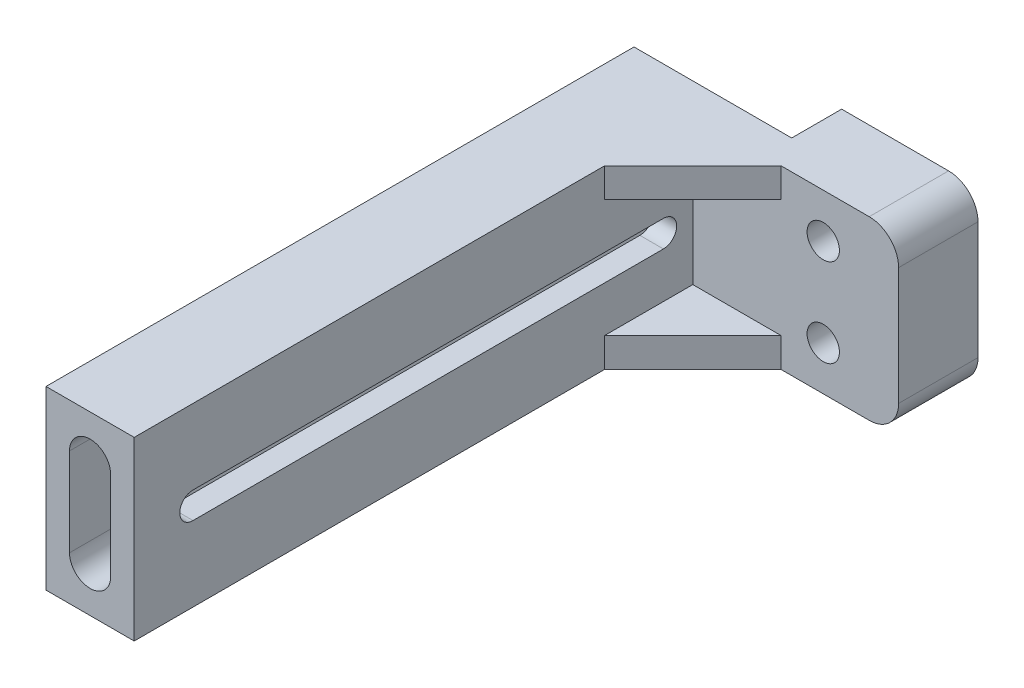
ISO-10303-21;
HEADER;
FILE_DESCRIPTION(('STEP AP214'),'2;1');
FILE_NAME('part.step','',(''),(''),'','','');
FILE_SCHEMA(('AUTOMOTIVE_DESIGN { 1 0 10303 214 1 1 1 1 }'));
ENDSEC;
DATA;
#1=APPLICATION_CONTEXT('core data for automotive mechanical design processes');
#2=APPLICATION_PROTOCOL_DEFINITION('international standard','automotive_design',2000,#1);
#3=PRODUCT_CONTEXT('',#1,'mechanical');
#4=PRODUCT('Part','Part','',(#3));
#5=PRODUCT_RELATED_PRODUCT_CATEGORY('part','',(#4));
#6=PRODUCT_DEFINITION_FORMATION('','',#4);
#7=PRODUCT_DEFINITION_CONTEXT('part definition',#1,'design');
#8=PRODUCT_DEFINITION('design','',#6,#7);
#9=PRODUCT_DEFINITION_SHAPE('','',#8);
#10=(LENGTH_UNIT() NAMED_UNIT(*) SI_UNIT(.MILLI.,.METRE.));
#11=(NAMED_UNIT(*) PLANE_ANGLE_UNIT() SI_UNIT($,.RADIAN.));
#12=(NAMED_UNIT(*) SI_UNIT($,.STERADIAN.) SOLID_ANGLE_UNIT());
#13=UNCERTAINTY_MEASURE_WITH_UNIT(LENGTH_MEASURE(1.E-05),#10,'distance_accuracy_value','');
#14=(GEOMETRIC_REPRESENTATION_CONTEXT(3) GLOBAL_UNCERTAINTY_ASSIGNED_CONTEXT((#13)) GLOBAL_UNIT_ASSIGNED_CONTEXT((#10,
#11,#12)) REPRESENTATION_CONTEXT('',''));
#15=CARTESIAN_POINT('',(0.,0.,0.));
#16=DIRECTION('',(0.,0.,1.));
#17=DIRECTION('',(1.,0.,0.));
#18=AXIS2_PLACEMENT_3D('',#15,#16,#17);
#19=CARTESIAN_POINT('',(0.,0.,0.));
#20=DIRECTION('',(0.,0.,-1.));
#21=DIRECTION('',(-1.,0.,0.));
#22=AXIS2_PLACEMENT_3D('',#19,#20,#21);
#23=PLANE('',#22);
#24=DIRECTION('',(0.,-1.,0.));
#25=VECTOR('',#24,1.);
#26=CARTESIAN_POINT('',(-3.5,0.,0.));
#27=LINE('',#26,#25);
#28=CARTESIAN_POINT('',(-3.5,15.,0.));
#29=VERTEX_POINT('',#28);
#30=CARTESIAN_POINT('',(-3.5,0.,0.));
#31=VERTEX_POINT('',#30);
#32=EDGE_CURVE('E302',#29,#31,#27,.T.);
#33=ORIENTED_EDGE('',*,*,#32,.T.);
#34=CARTESIAN_POINT('',(0.,0.,0.));
#35=DIRECTION('',(0.,0.,1.));
#36=DIRECTION('',(1.,0.,0.));
#37=AXIS2_PLACEMENT_3D('',#34,#35,#36);
#38=CIRCLE('',#37,3.5);
#39=CARTESIAN_POINT('',(3.5,0.,0.));
#40=VERTEX_POINT('',#39);
#41=EDGE_CURVE('E334',#31,#40,#38,.T.);
#42=ORIENTED_EDGE('',*,*,#41,.T.);
#43=DIRECTION('',(0.,1.,0.));
#44=VECTOR('',#43,1.);
#45=CARTESIAN_POINT('',(3.5,0.,0.));
#46=LINE('',#45,#44);
#47=CARTESIAN_POINT('',(3.5,15.,0.));
#48=VERTEX_POINT('',#47);
#49=EDGE_CURVE('E339',#40,#48,#46,.T.);
#50=ORIENTED_EDGE('',*,*,#49,.T.);
#51=CARTESIAN_POINT('',(0.,15.,0.));
#52=DIRECTION('',(0.,0.,1.));
#53=DIRECTION('',(1.,0.,0.));
#54=AXIS2_PLACEMENT_3D('',#51,#52,#53);
#55=CIRCLE('',#54,3.5);
#56=EDGE_CURVE('E335',#48,#29,#55,.T.);
#57=ORIENTED_EDGE('',*,*,#56,.T.);
#58=EDGE_LOOP('',(#33,#42,#50,#57));
#59=FACE_BOUND('',#58,.T.);
#60=DIRECTION('',(-1.,0.,0.));
#61=VECTOR('',#60,1.);
#62=CARTESIAN_POINT('',(-7.5,22.5,0.));
#63=LINE('',#62,#61);
#64=CARTESIAN_POINT('',(19.3141127463993,22.5,0.));
#65=VERTEX_POINT('',#64);
#66=CARTESIAN_POINT('',(-7.5,22.5,0.));
#67=VERTEX_POINT('',#66);
#68=EDGE_CURVE('E293',#65,#67,#63,.T.);
#69=ORIENTED_EDGE('',*,*,#68,.F.);
#70=CARTESIAN_POINT('',(-23.5,7.5,0.));
#71=DIRECTION('',(0.,0.,-1.));
#72=DIRECTION('',(-1.,0.,0.));
#73=AXIS2_PLACEMENT_3D('',#70,#71,#72);
#74=CIRCLE('',#73,45.365716684093);
#75=CARTESIAN_POINT('',(19.3141127463993,-7.5,0.));
#76=VERTEX_POINT('',#75);
#77=EDGE_CURVE('E250',#65,#76,#74,.T.);
#78=ORIENTED_EDGE('',*,*,#77,.T.);
#79=DIRECTION('',(1.,0.,0.));
#80=VECTOR('',#79,1.);
#81=CARTESIAN_POINT('',(-7.5,-7.5,0.));
#82=LINE('',#81,#80);
#83=CARTESIAN_POINT('',(-7.5,-7.5,0.));
#84=VERTEX_POINT('',#83);
#85=EDGE_CURVE('E304',#84,#76,#82,.T.);
#86=ORIENTED_EDGE('',*,*,#85,.F.);
#87=DIRECTION('',(0.,-1.,0.));
#88=VECTOR('',#87,1.);
#89=CARTESIAN_POINT('',(-7.5,-7.5,0.));
#90=LINE('',#89,#88);
#91=EDGE_CURVE('E298',#67,#84,#90,.T.);
#92=ORIENTED_EDGE('',*,*,#91,.F.);
#93=EDGE_LOOP('',(#69,#78,#86,#92));
#94=FACE_BOUND('',#93,.T.);
#95=ADVANCED_FACE('F35',(#59,#94),#23,.T.);
#96=CARTESIAN_POINT('',(7.5,-7.5,100.));
#97=DIRECTION('',(-1.,0.,0.));
#98=DIRECTION('',(0.,0.,1.));
#99=AXIS2_PLACEMENT_3D('',#96,#97,#98);
#100=PLANE('',#99);
#101=DIRECTION('',(0.,0.,-1.));
#102=VECTOR('',#101,1.);
#103=CARTESIAN_POINT('',(7.5,9.74999999999999,10.));
#104=LINE('',#103,#102);
#105=CARTESIAN_POINT('',(7.5,9.75000000000002,90.));
#106=VERTEX_POINT('',#105);
#107=CARTESIAN_POINT('',(7.5,9.74999999999999,10.));
#108=VERTEX_POINT('',#107);
#109=EDGE_CURVE('E338',#106,#108,#104,.T.);
#110=ORIENTED_EDGE('',*,*,#109,.T.);
#111=CARTESIAN_POINT('',(7.5,7.49999999999999,10.));
#112=DIRECTION('',(-1.,0.,0.));
#113=DIRECTION('',(0.,-1.,0.));
#114=AXIS2_PLACEMENT_3D('',#111,#112,#113);
#115=CIRCLE('',#114,2.25);
#116=CARTESIAN_POINT('',(7.5,5.24999999999999,10.));
#117=VERTEX_POINT('',#116);
#118=EDGE_CURVE('E380',#108,#117,#115,.T.);
#119=ORIENTED_EDGE('',*,*,#118,.T.);
#120=DIRECTION('',(0.,0.,1.));
#121=VECTOR('',#120,1.);
#122=CARTESIAN_POINT('',(7.5,5.24999999999999,10.));
#123=LINE('',#122,#121);
#124=CARTESIAN_POINT('',(7.5,5.25000000000002,90.));
#125=VERTEX_POINT('',#124);
#126=EDGE_CURVE('E383',#117,#125,#123,.T.);
#127=ORIENTED_EDGE('',*,*,#126,.T.);
#128=CARTESIAN_POINT('',(7.5,7.50000000000002,90.));
#129=DIRECTION('',(-1.,0.,0.));
#130=DIRECTION('',(0.,-1.,0.));
#131=AXIS2_PLACEMENT_3D('',#128,#129,#130);
#132=CIRCLE('',#131,2.25);
#133=EDGE_CURVE('E319',#125,#106,#132,.T.);
#134=ORIENTED_EDGE('',*,*,#133,.T.);
#135=EDGE_LOOP('',(#110,#119,#127,#134));
#136=FACE_BOUND('',#135,.T.);
#137=DIRECTION('',(0.,0.,1.));
#138=VECTOR('',#137,1.);
#139=CARTESIAN_POINT('',(7.5,17.5,5.));
#140=LINE('',#139,#138);
#141=CARTESIAN_POINT('',(7.5,17.5,5.));
#142=VERTEX_POINT('',#141);
#143=CARTESIAN_POINT('',(7.5,17.5,20.));
#144=VERTEX_POINT('',#143);
#145=EDGE_CURVE('E50',#142,#144,#140,.T.);
#146=ORIENTED_EDGE('',*,*,#145,.T.);
#147=DIRECTION('',(0.,1.,0.));
#148=VECTOR('',#147,1.);
#149=CARTESIAN_POINT('',(7.5,17.5,20.));
#150=LINE('',#149,#148);
#151=CARTESIAN_POINT('',(7.5,22.5,20.));
#152=VERTEX_POINT('',#151);
#153=EDGE_CURVE('E54',#144,#152,#150,.T.);
#154=ORIENTED_EDGE('',*,*,#153,.T.);
#155=DIRECTION('',(0.,0.,-1.));
#156=VECTOR('',#155,1.);
#157=CARTESIAN_POINT('',(7.5,22.5,100.));
#158=LINE('',#157,#156);
#159=CARTESIAN_POINT('',(7.5,22.5,100.));
#160=VERTEX_POINT('',#159);
#161=EDGE_CURVE('E272',#160,#152,#158,.T.);
#162=ORIENTED_EDGE('',*,*,#161,.F.);
#163=DIRECTION('',(0.,1.,0.));
#164=VECTOR('',#163,1.);
#165=CARTESIAN_POINT('',(7.5,-7.5,100.));
#166=LINE('',#165,#164);
#167=CARTESIAN_POINT('',(7.5,-7.5,100.));
#168=VERTEX_POINT('',#167);
#169=EDGE_CURVE('E316',#168,#160,#166,.T.);
#170=ORIENTED_EDGE('',*,*,#169,.F.);
#171=DIRECTION('',(0.,0.,1.));
#172=VECTOR('',#171,1.);
#173=CARTESIAN_POINT('',(7.5,-7.5,5.));
#174=LINE('',#173,#172);
#175=CARTESIAN_POINT('',(7.5,-7.5,20.));
#176=VERTEX_POINT('',#175);
#177=EDGE_CURVE('E303',#176,#168,#174,.T.);
#178=ORIENTED_EDGE('',*,*,#177,.F.);
#179=DIRECTION('',(0.,-1.,0.));
#180=VECTOR('',#179,1.);
#181=CARTESIAN_POINT('',(7.5,-2.5,20.));
#182=LINE('',#181,#180);
#183=CARTESIAN_POINT('',(7.5,-2.5,20.));
#184=VERTEX_POINT('',#183);
#185=EDGE_CURVE('E217',#184,#176,#182,.T.);
#186=ORIENTED_EDGE('',*,*,#185,.F.);
#187=DIRECTION('',(0.,0.,-1.));
#188=VECTOR('',#187,1.);
#189=CARTESIAN_POINT('',(7.5,-2.5,5.));
#190=LINE('',#189,#188);
#191=CARTESIAN_POINT('',(7.5,-2.5,5.));
#192=VERTEX_POINT('',#191);
#193=EDGE_CURVE('E218',#184,#192,#190,.T.);
#194=ORIENTED_EDGE('',*,*,#193,.T.);
#195=DIRECTION('',(0.,-1.,0.));
#196=VECTOR('',#195,1.);
#197=CARTESIAN_POINT('',(7.5,-7.5,5.));
#198=LINE('',#197,#196);
#199=EDGE_CURVE('E228',#142,#192,#198,.T.);
#200=ORIENTED_EDGE('',*,*,#199,.F.);
#201=EDGE_LOOP('',(#146,#154,#162,#170,#178,#186,#194,#200));
#202=FACE_BOUND('',#201,.T.);
#203=ADVANCED_FACE('F433',(#136,#202),#100,.F.);
#204=CARTESIAN_POINT('',(-7.5,22.5,100.));
#205=DIRECTION('',(0.,-1.,0.));
#206=DIRECTION('',(0.,0.,-1.));
#207=AXIS2_PLACEMENT_3D('',#204,#205,#206);
#208=PLANE('',#207);
#209=ORIENTED_EDGE('',*,*,#161,.T.);
#210=DIRECTION('',(0.707106781186547,0.,-0.707106781186547));
#211=VECTOR('',#210,1.);
#212=CARTESIAN_POINT('',(7.5,22.5,20.));
#213=LINE('',#212,#211);
#214=CARTESIAN_POINT('',(22.5,22.5,5.));
#215=VERTEX_POINT('',#214);
#216=EDGE_CURVE('E421',#152,#215,#213,.T.);
#217=ORIENTED_EDGE('',*,*,#216,.T.);
#218=DIRECTION('',(-1.,0.,0.));
#219=VECTOR('',#218,1.);
#220=CARTESIAN_POINT('',(72.9138126514911,22.5,5.));
#221=LINE('',#220,#219);
#222=CARTESIAN_POINT('',(37.5,22.5,5.));
#223=VERTEX_POINT('',#222);
#224=EDGE_CURVE('E259',#223,#215,#221,.T.);
#225=ORIENTED_EDGE('',*,*,#224,.F.);
#226=DIRECTION('',(0.,0.,1.));
#227=VECTOR('',#226,1.);
#228=CARTESIAN_POINT('',(37.5,22.5,-8.5));
#229=LINE('',#228,#227);
#230=CARTESIAN_POINT('',(37.5,22.5,-8.5));
#231=VERTEX_POINT('',#230);
#232=EDGE_CURVE('E398',#223,#231,#229,.F.);
#233=ORIENTED_EDGE('',*,*,#232,.T.);
#234=DIRECTION('',(-1.,0.,0.));
#235=VECTOR('',#234,1.);
#236=CARTESIAN_POINT('',(22.5,22.5,-8.5));
#237=LINE('',#236,#235);
#238=CARTESIAN_POINT('',(19.3141127463993,22.5,-8.50000000000001));
#239=VERTEX_POINT('',#238);
#240=EDGE_CURVE('E253',#231,#239,#237,.T.);
#241=ORIENTED_EDGE('',*,*,#240,.T.);
#242=DIRECTION('',(0.,0.,1.));
#243=VECTOR('',#242,1.);
#244=CARTESIAN_POINT('',(19.3141127463993,22.5,-46.4155029999166));
#245=LINE('',#244,#243);
#246=EDGE_CURVE('E255',#239,#65,#245,.T.);
#247=ORIENTED_EDGE('',*,*,#246,.T.);
#248=ORIENTED_EDGE('',*,*,#68,.T.);
#249=DIRECTION('',(0.,0.,-1.));
#250=VECTOR('',#249,1.);
#251=CARTESIAN_POINT('',(-7.5,22.5,100.));
#252=LINE('',#251,#250);
#253=CARTESIAN_POINT('',(-7.5,22.5,100.));
#254=VERTEX_POINT('',#253);
#255=EDGE_CURVE('E294',#254,#67,#252,.T.);
#256=ORIENTED_EDGE('',*,*,#255,.F.);
#257=DIRECTION('',(-1.,0.,0.));
#258=VECTOR('',#257,1.);
#259=CARTESIAN_POINT('',(-7.5,22.5,100.));
#260=LINE('',#259,#258);
#261=EDGE_CURVE('E314',#160,#254,#260,.T.);
#262=ORIENTED_EDGE('',*,*,#261,.F.);
#263=EDGE_LOOP('',(#209,#217,#225,#233,#241,#247,#248,#256,#262));
#264=FACE_BOUND('',#263,.T.);
#265=ADVANCED_FACE('F419',(#264),#208,.F.);
#266=CARTESIAN_POINT('',(-7.5,-7.5,100.));
#267=DIRECTION('',(0.,1.,0.));
#268=DIRECTION('',(0.,0.,1.));
#269=AXIS2_PLACEMENT_3D('',#266,#267,#268);
#270=PLANE('',#269);
#271=DIRECTION('',(-0.707106781186547,0.,0.707106781186547));
#272=VECTOR('',#271,1.);
#273=CARTESIAN_POINT('',(7.5,-7.5,20.));
#274=LINE('',#273,#272);
#275=CARTESIAN_POINT('',(22.5,-7.5,5.));
#276=VERTEX_POINT('',#275);
#277=EDGE_CURVE('E212',#276,#176,#274,.T.);
#278=ORIENTED_EDGE('',*,*,#277,.T.);
#279=ORIENTED_EDGE('',*,*,#177,.T.);
#280=DIRECTION('',(1.,0.,0.));
#281=VECTOR('',#280,1.);
#282=CARTESIAN_POINT('',(-7.5,-7.5,100.));
#283=LINE('',#282,#281);
#284=CARTESIAN_POINT('',(-7.5,-7.5,100.));
#285=VERTEX_POINT('',#284);
#286=EDGE_CURVE('E308',#285,#168,#283,.T.);
#287=ORIENTED_EDGE('',*,*,#286,.F.);
#288=DIRECTION('',(0.,0.,-1.));
#289=VECTOR('',#288,1.);
#290=CARTESIAN_POINT('',(-7.5,-7.5,100.));
#291=LINE('',#290,#289);
#292=EDGE_CURVE('E299',#285,#84,#291,.T.);
#293=ORIENTED_EDGE('',*,*,#292,.T.);
#294=ORIENTED_EDGE('',*,*,#85,.T.);
#295=DIRECTION('',(0.,0.,1.));
#296=VECTOR('',#295,1.);
#297=CARTESIAN_POINT('',(19.3141127463993,-7.5,-46.4155029999166));
#298=LINE('',#297,#296);
#299=CARTESIAN_POINT('',(19.3141127463993,-7.5,-8.5));
#300=VERTEX_POINT('',#299);
#301=EDGE_CURVE('E260',#300,#76,#298,.T.);
#302=ORIENTED_EDGE('',*,*,#301,.F.);
#303=DIRECTION('',(-1.,0.,0.));
#304=VECTOR('',#303,1.);
#305=CARTESIAN_POINT('',(42.5,-7.5,-8.5));
#306=LINE('',#305,#304);
#307=CARTESIAN_POINT('',(37.5,-7.5,-8.5));
#308=VERTEX_POINT('',#307);
#309=EDGE_CURVE('E249',#308,#300,#306,.T.);
#310=ORIENTED_EDGE('',*,*,#309,.F.);
#311=DIRECTION('',(0.,0.,-1.));
#312=VECTOR('',#311,1.);
#313=CARTESIAN_POINT('',(37.5,-7.5,5.));
#314=LINE('',#313,#312);
#315=CARTESIAN_POINT('',(37.5,-7.5,5.));
#316=VERTEX_POINT('',#315);
#317=EDGE_CURVE('E11',#308,#316,#314,.F.);
#318=ORIENTED_EDGE('',*,*,#317,.T.);
#319=DIRECTION('',(-1.,0.,0.));
#320=VECTOR('',#319,1.);
#321=CARTESIAN_POINT('',(72.9138126514911,-7.5,5.));
#322=LINE('',#321,#320);
#323=EDGE_CURVE('E268',#316,#276,#322,.T.);
#324=ORIENTED_EDGE('',*,*,#323,.T.);
#325=EDGE_LOOP('',(#278,#279,#287,#293,#294,#302,#310,#318,#324));
#326=FACE_BOUND('',#325,.T.);
#327=ADVANCED_FACE('F460',(#326),#270,.F.);
#328=CARTESIAN_POINT('',(0.,0.,100.));
#329=DIRECTION('',(0.,0.,-1.));
#330=DIRECTION('',(-1.,0.,0.));
#331=AXIS2_PLACEMENT_3D('',#328,#329,#330);
#332=PLANE('',#331);
#333=ORIENTED_EDGE('',*,*,#169,.T.);
#334=ORIENTED_EDGE('',*,*,#261,.T.);
#335=DIRECTION('',(0.,-1.,0.));
#336=VECTOR('',#335,1.);
#337=CARTESIAN_POINT('',(-7.5,-7.5,100.));
#338=LINE('',#337,#336);
#339=EDGE_CURVE('E312',#254,#285,#338,.T.);
#340=ORIENTED_EDGE('',*,*,#339,.T.);
#341=ORIENTED_EDGE('',*,*,#286,.T.);
#342=EDGE_LOOP('',(#333,#334,#340,#341));
#343=FACE_BOUND('',#342,.T.);
#344=CARTESIAN_POINT('',(0.,0.,100.));
#345=DIRECTION('',(0.,0.,1.));
#346=DIRECTION('',(1.,0.,0.));
#347=AXIS2_PLACEMENT_3D('',#344,#345,#346);
#348=CIRCLE('',#347,3.5);
#349=CARTESIAN_POINT('',(-3.5,0.,100.));
#350=VERTEX_POINT('',#349);
#351=CARTESIAN_POINT('',(3.5,0.,100.));
#352=VERTEX_POINT('',#351);
#353=EDGE_CURVE('E297',#350,#352,#348,.T.);
#354=ORIENTED_EDGE('',*,*,#353,.F.);
#355=DIRECTION('',(0.,-1.,0.));
#356=VECTOR('',#355,1.);
#357=CARTESIAN_POINT('',(-3.5,0.,100.));
#358=LINE('',#357,#356);
#359=CARTESIAN_POINT('',(-3.5,15.,100.));
#360=VERTEX_POINT('',#359);
#361=EDGE_CURVE('E329',#360,#350,#358,.T.);
#362=ORIENTED_EDGE('',*,*,#361,.F.);
#363=CARTESIAN_POINT('',(0.,15.,100.));
#364=DIRECTION('',(0.,0.,1.));
#365=DIRECTION('',(1.,0.,0.));
#366=AXIS2_PLACEMENT_3D('',#363,#364,#365);
#367=CIRCLE('',#366,3.5);
#368=CARTESIAN_POINT('',(3.5,15.,100.));
#369=VERTEX_POINT('',#368);
#370=EDGE_CURVE('E326',#369,#360,#367,.T.);
#371=ORIENTED_EDGE('',*,*,#370,.F.);
#372=DIRECTION('',(0.,1.,0.));
#373=VECTOR('',#372,1.);
#374=CARTESIAN_POINT('',(3.5,0.,100.));
#375=LINE('',#374,#373);
#376=EDGE_CURVE('E323',#352,#369,#375,.T.);
#377=ORIENTED_EDGE('',*,*,#376,.F.);
#378=EDGE_LOOP('',(#354,#362,#371,#377));
#379=FACE_BOUND('',#378,.T.);
#380=ADVANCED_FACE('F457',(#343,#379),#332,.F.);
#381=CARTESIAN_POINT('',(-7.5,-7.5,100.));
#382=DIRECTION('',(1.,0.,0.));
#383=DIRECTION('',(0.,0.,-1.));
#384=AXIS2_PLACEMENT_3D('',#381,#382,#383);
#385=PLANE('',#384);
#386=DIRECTION('',(0.,0.,1.));
#387=VECTOR('',#386,1.);
#388=CARTESIAN_POINT('',(-7.5,5.24999999999999,10.));
#389=LINE('',#388,#387);
#390=CARTESIAN_POINT('',(-7.5,5.24999999999999,10.));
#391=VERTEX_POINT('',#390);
#392=CARTESIAN_POINT('',(-7.5,5.25000000000001,90.));
#393=VERTEX_POINT('',#392);
#394=EDGE_CURVE('E287',#391,#393,#389,.T.);
#395=ORIENTED_EDGE('',*,*,#394,.F.);
#396=CARTESIAN_POINT('',(-7.5,7.49999999999999,10.));
#397=DIRECTION('',(-1.,0.,0.));
#398=DIRECTION('',(0.,-1.,0.));
#399=AXIS2_PLACEMENT_3D('',#396,#397,#398);
#400=CIRCLE('',#399,2.25);
#401=CARTESIAN_POINT('',(-7.5,9.74999999999999,10.));
#402=VERTEX_POINT('',#401);
#403=EDGE_CURVE('E353',#402,#391,#400,.T.);
#404=ORIENTED_EDGE('',*,*,#403,.F.);
#405=DIRECTION('',(0.,0.,-1.));
#406=VECTOR('',#405,1.);
#407=CARTESIAN_POINT('',(-7.5,9.74999999999999,10.));
#408=LINE('',#407,#406);
#409=CARTESIAN_POINT('',(-7.5,9.75000000000001,90.));
#410=VERTEX_POINT('',#409);
#411=EDGE_CURVE('E278',#410,#402,#408,.T.);
#412=ORIENTED_EDGE('',*,*,#411,.F.);
#413=CARTESIAN_POINT('',(-7.5,7.50000000000001,90.));
#414=DIRECTION('',(-1.,0.,0.));
#415=DIRECTION('',(0.,-1.,0.));
#416=AXIS2_PLACEMENT_3D('',#413,#414,#415);
#417=CIRCLE('',#416,2.25);
#418=EDGE_CURVE('E282',#393,#410,#417,.T.);
#419=ORIENTED_EDGE('',*,*,#418,.F.);
#420=EDGE_LOOP('',(#395,#404,#412,#419));
#421=FACE_BOUND('',#420,.T.);
#422=ORIENTED_EDGE('',*,*,#91,.T.);
#423=ORIENTED_EDGE('',*,*,#292,.F.);
#424=ORIENTED_EDGE('',*,*,#339,.F.);
#425=ORIENTED_EDGE('',*,*,#255,.T.);
#426=EDGE_LOOP('',(#422,#423,#424,#425));
#427=FACE_BOUND('',#426,.T.);
#428=ADVANCED_FACE('F456',(#421,#427),#385,.F.);
#429=CARTESIAN_POINT('',(0.,0.,100.));
#430=DIRECTION('',(0.,0.,-1.));
#431=DIRECTION('',(-1.,0.,0.));
#432=AXIS2_PLACEMENT_3D('',#429,#430,#431);
#433=CYLINDRICAL_SURFACE('',#432,3.5);
#434=ORIENTED_EDGE('',*,*,#41,.F.);
#435=DIRECTION('',(0.,0.,-1.));
#436=VECTOR('',#435,1.);
#437=CARTESIAN_POINT('',(-3.5,0.,100.));
#438=LINE('',#437,#436);
#439=EDGE_CURVE('E291',#350,#31,#438,.T.);
#440=ORIENTED_EDGE('',*,*,#439,.F.);
#441=ORIENTED_EDGE('',*,*,#353,.T.);
#442=DIRECTION('',(0.,0.,-1.));
#443=VECTOR('',#442,1.);
#444=CARTESIAN_POINT('',(3.5,0.,100.));
#445=LINE('',#444,#443);
#446=EDGE_CURVE('E320',#352,#40,#445,.T.);
#447=ORIENTED_EDGE('',*,*,#446,.T.);
#448=EDGE_LOOP('',(#434,#440,#441,#447));
#449=FACE_BOUND('',#448,.T.);
#450=ADVANCED_FACE('F462',(#449),#433,.F.);
#451=CARTESIAN_POINT('',(3.5,0.,100.));
#452=DIRECTION('',(-1.,0.,0.));
#453=DIRECTION('',(0.,-1.,0.));
#454=AXIS2_PLACEMENT_3D('',#451,#452,#453);
#455=PLANE('',#454);
#456=CARTESIAN_POINT('',(3.5,7.49999999999999,10.));
#457=DIRECTION('',(-1.,0.,0.));
#458=DIRECTION('',(0.,-1.,0.));
#459=AXIS2_PLACEMENT_3D('',#456,#457,#458);
#460=CIRCLE('',#459,2.25);
#461=CARTESIAN_POINT('',(3.5,9.74999999999999,10.));
#462=VERTEX_POINT('',#461);
#463=CARTESIAN_POINT('',(3.5,5.24999999999999,10.));
#464=VERTEX_POINT('',#463);
#465=EDGE_CURVE('E349',#462,#464,#460,.T.);
#466=ORIENTED_EDGE('',*,*,#465,.F.);
#467=DIRECTION('',(0.,0.,-1.));
#468=VECTOR('',#467,1.);
#469=CARTESIAN_POINT('',(3.5,9.75000000000002,100.));
#470=LINE('',#469,#468);
#471=CARTESIAN_POINT('',(3.5,9.75000000000001,90.));
#472=VERTEX_POINT('',#471);
#473=EDGE_CURVE('E354',#472,#462,#470,.T.);
#474=ORIENTED_EDGE('',*,*,#473,.F.);
#475=CARTESIAN_POINT('',(3.5,7.50000000000002,90.));
#476=DIRECTION('',(-1.,0.,0.));
#477=DIRECTION('',(0.,-1.,0.));
#478=AXIS2_PLACEMENT_3D('',#475,#476,#477);
#479=CIRCLE('',#478,2.25);
#480=CARTESIAN_POINT('',(3.5,5.25000000000002,90.));
#481=VERTEX_POINT('',#480);
#482=EDGE_CURVE('E357',#481,#472,#479,.T.);
#483=ORIENTED_EDGE('',*,*,#482,.F.);
#484=DIRECTION('',(0.,0.,1.));
#485=VECTOR('',#484,1.);
#486=CARTESIAN_POINT('',(3.5,5.25000000000002,100.));
#487=LINE('',#486,#485);
#488=EDGE_CURVE('E360',#464,#481,#487,.T.);
#489=ORIENTED_EDGE('',*,*,#488,.F.);
#490=EDGE_LOOP('',(#466,#474,#483,#489));
#491=FACE_BOUND('',#490,.T.);
#492=ORIENTED_EDGE('',*,*,#49,.F.);
#493=ORIENTED_EDGE('',*,*,#446,.F.);
#494=ORIENTED_EDGE('',*,*,#376,.T.);
#495=DIRECTION('',(0.,0.,-1.));
#496=VECTOR('',#495,1.);
#497=CARTESIAN_POINT('',(3.5,15.,100.));
#498=LINE('',#497,#496);
#499=EDGE_CURVE('E324',#369,#48,#498,.T.);
#500=ORIENTED_EDGE('',*,*,#499,.T.);
#501=EDGE_LOOP('',(#492,#493,#494,#500));
#502=FACE_BOUND('',#501,.T.);
#503=ADVANCED_FACE('F465',(#491,#502),#455,.T.);
#504=CARTESIAN_POINT('',(0.,15.,100.));
#505=DIRECTION('',(0.,0.,-1.));
#506=DIRECTION('',(-1.,0.,0.));
#507=AXIS2_PLACEMENT_3D('',#504,#505,#506);
#508=CYLINDRICAL_SURFACE('',#507,3.5);
#509=ORIENTED_EDGE('',*,*,#56,.F.);
#510=ORIENTED_EDGE('',*,*,#499,.F.);
#511=ORIENTED_EDGE('',*,*,#370,.T.);
#512=DIRECTION('',(0.,0.,-1.));
#513=VECTOR('',#512,1.);
#514=CARTESIAN_POINT('',(-3.5,15.,100.));
#515=LINE('',#514,#513);
#516=EDGE_CURVE('E327',#360,#29,#515,.T.);
#517=ORIENTED_EDGE('',*,*,#516,.T.);
#518=EDGE_LOOP('',(#509,#510,#511,#517));
#519=FACE_BOUND('',#518,.T.);
#520=ADVANCED_FACE('F469',(#519),#508,.F.);
#521=CARTESIAN_POINT('',(-3.5,0.,100.));
#522=DIRECTION('',(1.,0.,0.));
#523=DIRECTION('',(0.,1.,0.));
#524=AXIS2_PLACEMENT_3D('',#521,#522,#523);
#525=PLANE('',#524);
#526=CARTESIAN_POINT('',(-3.5,7.49999999999999,10.));
#527=DIRECTION('',(1.,0.,0.));
#528=DIRECTION('',(0.,1.,0.));
#529=AXIS2_PLACEMENT_3D('',#526,#527,#528);
#530=CIRCLE('',#529,2.25);
#531=CARTESIAN_POINT('',(-3.5,5.24999999999999,10.));
#532=VERTEX_POINT('',#531);
#533=CARTESIAN_POINT('',(-3.5,9.74999999999999,10.));
#534=VERTEX_POINT('',#533);
#535=EDGE_CURVE('E275',#532,#534,#530,.T.);
#536=ORIENTED_EDGE('',*,*,#535,.F.);
#537=DIRECTION('',(0.,0.,-1.));
#538=VECTOR('',#537,1.);
#539=CARTESIAN_POINT('',(-3.5,5.25000000000002,100.));
#540=LINE('',#539,#538);
#541=CARTESIAN_POINT('',(-3.5,5.25000000000001,90.));
#542=VERTEX_POINT('',#541);
#543=EDGE_CURVE('E288',#542,#532,#540,.T.);
#544=ORIENTED_EDGE('',*,*,#543,.F.);
#545=CARTESIAN_POINT('',(-3.5,7.50000000000001,90.));
#546=DIRECTION('',(1.,0.,0.));
#547=DIRECTION('',(0.,1.,0.));
#548=AXIS2_PLACEMENT_3D('',#545,#546,#547);
#549=CIRCLE('',#548,2.25);
#550=CARTESIAN_POINT('',(-3.5,9.75000000000001,90.));
#551=VERTEX_POINT('',#550);
#552=EDGE_CURVE('E283',#551,#542,#549,.T.);
#553=ORIENTED_EDGE('',*,*,#552,.F.);
#554=DIRECTION('',(0.,0.,1.));
#555=VECTOR('',#554,1.);
#556=CARTESIAN_POINT('',(-3.5,9.75000000000002,100.));
#557=LINE('',#556,#555);
#558=EDGE_CURVE('E279',#534,#551,#557,.T.);
#559=ORIENTED_EDGE('',*,*,#558,.F.);
#560=EDGE_LOOP('',(#536,#544,#553,#559));
#561=FACE_BOUND('',#560,.T.);
#562=ORIENTED_EDGE('',*,*,#32,.F.);
#563=ORIENTED_EDGE('',*,*,#516,.F.);
#564=ORIENTED_EDGE('',*,*,#361,.T.);
#565=ORIENTED_EDGE('',*,*,#439,.T.);
#566=EDGE_LOOP('',(#562,#563,#564,#565));
#567=FACE_BOUND('',#566,.T.);
#568=ADVANCED_FACE('F473',(#561,#567),#525,.T.);
#569=CARTESIAN_POINT('',(7.5,5.24999999999999,10.));
#570=DIRECTION('',(0.,-1.,0.));
#571=DIRECTION('',(0.,0.,-1.));
#572=AXIS2_PLACEMENT_3D('',#569,#570,#571);
#573=PLANE('',#572);
#574=ORIENTED_EDGE('',*,*,#543,.T.);
#575=DIRECTION('',(-1.,0.,0.));
#576=VECTOR('',#575,1.);
#577=CARTESIAN_POINT('',(7.5,5.24999999999999,10.));
#578=LINE('',#577,#576);
#579=EDGE_CURVE('E290',#532,#391,#578,.T.);
#580=ORIENTED_EDGE('',*,*,#579,.T.);
#581=ORIENTED_EDGE('',*,*,#394,.T.);
#582=DIRECTION('',(-1.,0.,0.));
#583=VECTOR('',#582,1.);
#584=CARTESIAN_POINT('',(7.50000000000001,5.25000000000002,90.));
#585=LINE('',#584,#583);
#586=EDGE_CURVE('E286',#542,#393,#585,.T.);
#587=ORIENTED_EDGE('',*,*,#586,.F.);
#588=EDGE_LOOP('',(#574,#580,#581,#587));
#589=FACE_BOUND('',#588,.T.);
#590=ADVANCED_FACE('F477',(#589),#573,.F.);
#591=CARTESIAN_POINT('',(7.5,7.50000000000002,90.));
#592=DIRECTION('',(-1.,0.,0.));
#593=DIRECTION('',(0.,-1.,0.));
#594=AXIS2_PLACEMENT_3D('',#591,#592,#593);
#595=CYLINDRICAL_SURFACE('',#594,2.25);
#596=ORIENTED_EDGE('',*,*,#552,.T.);
#597=ORIENTED_EDGE('',*,*,#586,.T.);
#598=ORIENTED_EDGE('',*,*,#418,.T.);
#599=DIRECTION('',(-1.,0.,0.));
#600=VECTOR('',#599,1.);
#601=CARTESIAN_POINT('',(7.5,9.75000000000002,90.));
#602=LINE('',#601,#600);
#603=EDGE_CURVE('E281',#551,#410,#602,.T.);
#604=ORIENTED_EDGE('',*,*,#603,.F.);
#605=EDGE_LOOP('',(#596,#597,#598,#604));
#606=FACE_BOUND('',#605,.T.);
#607=ADVANCED_FACE('F487',(#606),#595,.F.);
#608=CARTESIAN_POINT('',(7.5,9.74999999999999,10.));
#609=DIRECTION('',(0.,1.,0.));
#610=DIRECTION('',(0.,0.,1.));
#611=AXIS2_PLACEMENT_3D('',#608,#609,#610);
#612=PLANE('',#611);
#613=ORIENTED_EDGE('',*,*,#558,.T.);
#614=ORIENTED_EDGE('',*,*,#603,.T.);
#615=ORIENTED_EDGE('',*,*,#411,.T.);
#616=DIRECTION('',(-1.,0.,0.));
#617=VECTOR('',#616,1.);
#618=CARTESIAN_POINT('',(7.5,9.74999999999999,10.));
#619=LINE('',#618,#617);
#620=EDGE_CURVE('E277',#534,#402,#619,.T.);
#621=ORIENTED_EDGE('',*,*,#620,.F.);
#622=EDGE_LOOP('',(#613,#614,#615,#621));
#623=FACE_BOUND('',#622,.T.);
#624=ADVANCED_FACE('F483',(#623),#612,.F.);
#625=CARTESIAN_POINT('',(7.5,7.49999999999999,10.));
#626=DIRECTION('',(-1.,0.,0.));
#627=DIRECTION('',(0.,-1.,0.));
#628=AXIS2_PLACEMENT_3D('',#625,#626,#627);
#629=CYLINDRICAL_SURFACE('',#628,2.25);
#630=ORIENTED_EDGE('',*,*,#535,.T.);
#631=ORIENTED_EDGE('',*,*,#620,.T.);
#632=ORIENTED_EDGE('',*,*,#403,.T.);
#633=ORIENTED_EDGE('',*,*,#579,.F.);
#634=EDGE_LOOP('',(#630,#631,#632,#633));
#635=FACE_BOUND('',#634,.T.);
#636=ADVANCED_FACE('F479',(#635),#629,.F.);
#637=ORIENTED_EDGE('',*,*,#465,.T.);
#638=EDGE_CURVE('E362',#117,#464,#578,.T.);
#639=ORIENTED_EDGE('',*,*,#638,.F.);
#640=ORIENTED_EDGE('',*,*,#118,.F.);
#641=EDGE_CURVE('E352',#108,#462,#619,.T.);
#642=ORIENTED_EDGE('',*,*,#641,.T.);
#643=EDGE_LOOP('',(#637,#639,#640,#642));
#644=FACE_BOUND('',#643,.T.);
#645=ADVANCED_FACE('F482',(#644),#629,.F.);
#646=ORIENTED_EDGE('',*,*,#473,.T.);
#647=ORIENTED_EDGE('',*,*,#641,.F.);
#648=ORIENTED_EDGE('',*,*,#109,.F.);
#649=EDGE_CURVE('E356',#106,#472,#602,.T.);
#650=ORIENTED_EDGE('',*,*,#649,.T.);
#651=EDGE_LOOP('',(#646,#647,#648,#650));
#652=FACE_BOUND('',#651,.T.);
#653=ADVANCED_FACE('F497',(#652),#612,.F.);
#654=ORIENTED_EDGE('',*,*,#482,.T.);
#655=ORIENTED_EDGE('',*,*,#649,.F.);
#656=ORIENTED_EDGE('',*,*,#133,.F.);
#657=EDGE_CURVE('E359',#125,#481,#585,.T.);
#658=ORIENTED_EDGE('',*,*,#657,.T.);
#659=EDGE_LOOP('',(#654,#655,#656,#658));
#660=FACE_BOUND('',#659,.T.);
#661=ADVANCED_FACE('F493',(#660),#595,.F.);
#662=ORIENTED_EDGE('',*,*,#488,.T.);
#663=ORIENTED_EDGE('',*,*,#657,.F.);
#664=ORIENTED_EDGE('',*,*,#126,.F.);
#665=ORIENTED_EDGE('',*,*,#638,.T.);
#666=EDGE_LOOP('',(#662,#663,#664,#665));
#667=FACE_BOUND('',#666,.T.);
#668=ADVANCED_FACE('F489',(#667),#573,.F.);
#669=CARTESIAN_POINT('',(72.9138126514911,-7.5,5.));
#670=DIRECTION('',(0.,0.,-1.));
#671=DIRECTION('',(0.,1.,0.));
#672=AXIS2_PLACEMENT_3D('',#669,#670,#671);
#673=PLANE('',#672);
#674=CARTESIAN_POINT('',(29.6828583420465,0.,5.));
#675=DIRECTION('',(0.,0.,-1.));
#676=DIRECTION('',(0.,1.,0.));
#677=AXIS2_PLACEMENT_3D('',#674,#675,#676);
#678=CIRCLE('',#677,2.75);
#679=CARTESIAN_POINT('',(29.6828583420465,2.75,5.));
#680=VERTEX_POINT('',#679);
#681=EDGE_CURVE('E246',#680,#680,#678,.T.);
#682=ORIENTED_EDGE('',*,*,#681,.T.);
#683=EDGE_LOOP('',(#682));
#684=FACE_BOUND('',#683,.T.);
#685=CARTESIAN_POINT('',(29.6828583420465,15.,5.));
#686=DIRECTION('',(0.,0.,-1.));
#687=DIRECTION('',(0.,1.,0.));
#688=AXIS2_PLACEMENT_3D('',#685,#686,#687);
#689=CIRCLE('',#688,2.75);
#690=CARTESIAN_POINT('',(29.6828583420465,17.75,5.));
#691=VERTEX_POINT('',#690);
#692=EDGE_CURVE('E241',#691,#691,#689,.T.);
#693=ORIENTED_EDGE('',*,*,#692,.T.);
#694=EDGE_LOOP('',(#693));
#695=FACE_BOUND('',#694,.T.);
#696=ORIENTED_EDGE('',*,*,#224,.T.);
#697=DIRECTION('',(0.,1.,0.));
#698=VECTOR('',#697,1.);
#699=CARTESIAN_POINT('',(22.5,17.5,5.));
#700=LINE('',#699,#698);
#701=CARTESIAN_POINT('',(22.5,17.5,5.));
#702=VERTEX_POINT('',#701);
#703=EDGE_CURVE('E232',#702,#215,#700,.T.);
#704=ORIENTED_EDGE('',*,*,#703,.F.);
#705=DIRECTION('',(-1.,0.,0.));
#706=VECTOR('',#705,1.);
#707=CARTESIAN_POINT('',(22.5,17.5,5.));
#708=LINE('',#707,#706);
#709=EDGE_CURVE('E426',#702,#142,#708,.T.);
#710=ORIENTED_EDGE('',*,*,#709,.T.);
#711=ORIENTED_EDGE('',*,*,#199,.T.);
#712=DIRECTION('',(1.,0.,0.));
#713=VECTOR('',#712,1.);
#714=CARTESIAN_POINT('',(7.5,-2.5,5.));
#715=LINE('',#714,#713);
#716=CARTESIAN_POINT('',(22.5,-2.5,5.));
#717=VERTEX_POINT('',#716);
#718=EDGE_CURVE('E223',#192,#717,#715,.T.);
#719=ORIENTED_EDGE('',*,*,#718,.T.);
#720=DIRECTION('',(0.,-1.,0.));
#721=VECTOR('',#720,1.);
#722=CARTESIAN_POINT('',(22.5,-2.5,5.));
#723=LINE('',#722,#721);
#724=EDGE_CURVE('E206',#717,#276,#723,.T.);
#725=ORIENTED_EDGE('',*,*,#724,.T.);
#726=ORIENTED_EDGE('',*,*,#323,.F.);
#727=CARTESIAN_POINT('',(37.5,-2.5,5.));
#728=DIRECTION('',(0.,0.,-1.));
#729=DIRECTION('',(0.,1.,0.));
#730=AXIS2_PLACEMENT_3D('',#727,#728,#729);
#731=CIRCLE('',#730,5.);
#732=CARTESIAN_POINT('',(42.5,-2.5,5.));
#733=VERTEX_POINT('',#732);
#734=EDGE_CURVE('E394',#316,#733,#731,.F.);
#735=ORIENTED_EDGE('',*,*,#734,.T.);
#736=DIRECTION('',(0.,-1.,0.));
#737=VECTOR('',#736,1.);
#738=CARTESIAN_POINT('',(42.5,-7.50000000000001,5.));
#739=LINE('',#738,#737);
#740=CARTESIAN_POINT('',(42.5,17.5,5.));
#741=VERTEX_POINT('',#740);
#742=EDGE_CURVE('E269',#741,#733,#739,.T.);
#743=ORIENTED_EDGE('',*,*,#742,.F.);
#744=CARTESIAN_POINT('',(37.5,17.5,5.));
#745=DIRECTION('',(0.,0.,-1.));
#746=DIRECTION('',(0.,1.,0.));
#747=AXIS2_PLACEMENT_3D('',#744,#745,#746);
#748=CIRCLE('',#747,5.);
#749=EDGE_CURVE('E396',#741,#223,#748,.F.);
#750=ORIENTED_EDGE('',*,*,#749,.T.);
#751=EDGE_LOOP('',(#696,#704,#710,#711,#719,#725,#726,#735,#743,#750));
#752=FACE_BOUND('',#751,.T.);
#753=ADVANCED_FACE('F227',(#684,#695,#752),#673,.F.);
#754=CARTESIAN_POINT('',(42.5,0.,0.));
#755=DIRECTION('',(1.,0.,0.));
#756=DIRECTION('',(0.,1.,0.));
#757=AXIS2_PLACEMENT_3D('',#754,#755,#756);
#758=PLANE('',#757);
#759=DIRECTION('',(0.,1.,0.));
#760=VECTOR('',#759,1.);
#761=CARTESIAN_POINT('',(42.5,-7.5,-8.5));
#762=LINE('',#761,#760);
#763=CARTESIAN_POINT('',(42.5,-2.5,-8.5));
#764=VERTEX_POINT('',#763);
#765=CARTESIAN_POINT('',(42.5,17.5,-8.5));
#766=VERTEX_POINT('',#765);
#767=EDGE_CURVE('E256',#764,#766,#762,.T.);
#768=ORIENTED_EDGE('',*,*,#767,.T.);
#769=DIRECTION('',(0.,0.,1.));
#770=VECTOR('',#769,1.);
#771=CARTESIAN_POINT('',(42.5,17.5,5.));
#772=LINE('',#771,#770);
#773=EDGE_CURVE('E391',#766,#741,#772,.T.);
#774=ORIENTED_EDGE('',*,*,#773,.T.);
#775=ORIENTED_EDGE('',*,*,#742,.T.);
#776=DIRECTION('',(0.,0.,-1.));
#777=VECTOR('',#776,1.);
#778=CARTESIAN_POINT('',(42.5,-2.5,-8.5));
#779=LINE('',#778,#777);
#780=EDGE_CURVE('E364',#733,#764,#779,.T.);
#781=ORIENTED_EDGE('',*,*,#780,.T.);
#782=EDGE_LOOP('',(#768,#774,#775,#781));
#783=FACE_BOUND('',#782,.T.);
#784=ADVANCED_FACE('F411',(#783),#758,.T.);
#785=CARTESIAN_POINT('',(0.,0.,-8.5));
#786=DIRECTION('',(0.,0.,-1.));
#787=DIRECTION('',(-1.,0.,0.));
#788=AXIS2_PLACEMENT_3D('',#785,#786,#787);
#789=PLANE('',#788);
#790=CARTESIAN_POINT('',(29.6828583420465,0.,-8.5));
#791=DIRECTION('',(0.,0.,-1.));
#792=DIRECTION('',(-1.,0.,0.));
#793=AXIS2_PLACEMENT_3D('',#790,#791,#792);
#794=CIRCLE('',#793,2.75);
#795=CARTESIAN_POINT('',(26.9328583420465,0.,-8.5));
#796=VERTEX_POINT('',#795);
#797=EDGE_CURVE('E238',#796,#796,#794,.T.);
#798=ORIENTED_EDGE('',*,*,#797,.F.);
#799=EDGE_LOOP('',(#798));
#800=FACE_BOUND('',#799,.T.);
#801=CARTESIAN_POINT('',(29.6828583420465,15.,-8.5));
#802=DIRECTION('',(0.,0.,-1.));
#803=DIRECTION('',(-1.,0.,0.));
#804=AXIS2_PLACEMENT_3D('',#801,#802,#803);
#805=CIRCLE('',#804,2.75);
#806=CARTESIAN_POINT('',(26.9328583420465,15.,-8.5));
#807=VERTEX_POINT('',#806);
#808=EDGE_CURVE('E236',#807,#807,#805,.T.);
#809=ORIENTED_EDGE('',*,*,#808,.F.);
#810=EDGE_LOOP('',(#809));
#811=FACE_BOUND('',#810,.T.);
#812=ORIENTED_EDGE('',*,*,#240,.F.);
#813=CARTESIAN_POINT('',(37.5,17.5,-8.5));
#814=DIRECTION('',(0.,0.,-1.));
#815=DIRECTION('',(-1.,0.,0.));
#816=AXIS2_PLACEMENT_3D('',#813,#814,#815);
#817=CIRCLE('',#816,5.);
#818=EDGE_CURVE('E43',#231,#766,#817,.T.);
#819=ORIENTED_EDGE('',*,*,#818,.T.);
#820=ORIENTED_EDGE('',*,*,#767,.F.);
#821=CARTESIAN_POINT('',(37.5,-2.5,-8.5));
#822=DIRECTION('',(0.,0.,-1.));
#823=DIRECTION('',(-1.,0.,0.));
#824=AXIS2_PLACEMENT_3D('',#821,#822,#823);
#825=CIRCLE('',#824,5.);
#826=EDGE_CURVE('E400',#764,#308,#825,.T.);
#827=ORIENTED_EDGE('',*,*,#826,.T.);
#828=ORIENTED_EDGE('',*,*,#309,.T.);
#829=CARTESIAN_POINT('',(-23.5,7.5,-8.5));
#830=DIRECTION('',(0.,0.,-1.));
#831=DIRECTION('',(-1.,0.,0.));
#832=AXIS2_PLACEMENT_3D('',#829,#830,#831);
#833=CIRCLE('',#832,45.365716684093);
#834=EDGE_CURVE('E262',#239,#300,#833,.T.);
#835=ORIENTED_EDGE('',*,*,#834,.F.);
#836=EDGE_LOOP('',(#812,#819,#820,#827,#828,#835));
#837=FACE_BOUND('',#836,.T.);
#838=ADVANCED_FACE('F405',(#800,#811,#837),#789,.T.);
#839=CARTESIAN_POINT('',(-23.5,7.5,-46.4155029999166));
#840=DIRECTION('',(0.,0.,1.));
#841=DIRECTION('',(1.,0.,0.));
#842=AXIS2_PLACEMENT_3D('',#839,#840,#841);
#843=CYLINDRICAL_SURFACE('',#842,45.365716684093);
#844=ORIENTED_EDGE('',*,*,#246,.F.);
#845=ORIENTED_EDGE('',*,*,#834,.T.);
#846=ORIENTED_EDGE('',*,*,#301,.T.);
#847=ORIENTED_EDGE('',*,*,#77,.F.);
#848=EDGE_LOOP('',(#844,#845,#846,#847));
#849=FACE_BOUND('',#848,.T.);
#850=ADVANCED_FACE('F515',(#849),#843,.F.);
#851=CARTESIAN_POINT('',(29.6828583420465,15.,100.));
#852=DIRECTION('',(0.,0.,-1.));
#853=DIRECTION('',(-1.,0.,0.));
#854=AXIS2_PLACEMENT_3D('',#851,#852,#853);
#855=CYLINDRICAL_SURFACE('',#854,2.75);
#856=ORIENTED_EDGE('',*,*,#808,.T.);
#857=EDGE_LOOP('',(#856));
#858=FACE_BOUND('',#857,.T.);
#859=ORIENTED_EDGE('',*,*,#692,.F.);
#860=EDGE_LOOP('',(#859));
#861=FACE_BOUND('',#860,.T.);
#862=ADVANCED_FACE('F509',(#858,#861),#855,.F.);
#863=CARTESIAN_POINT('',(29.6828583420465,0.,100.));
#864=DIRECTION('',(0.,0.,-1.));
#865=DIRECTION('',(-1.,0.,0.));
#866=AXIS2_PLACEMENT_3D('',#863,#864,#865);
#867=CYLINDRICAL_SURFACE('',#866,2.75);
#868=ORIENTED_EDGE('',*,*,#797,.T.);
#869=EDGE_LOOP('',(#868));
#870=FACE_BOUND('',#869,.T.);
#871=ORIENTED_EDGE('',*,*,#681,.F.);
#872=EDGE_LOOP('',(#871));
#873=FACE_BOUND('',#872,.T.);
#874=ADVANCED_FACE('F503',(#870,#873),#867,.F.);
#875=CARTESIAN_POINT('',(37.5,17.5,0.));
#876=DIRECTION('',(0.,0.,-1.));
#877=DIRECTION('',(-1.,0.,0.));
#878=AXIS2_PLACEMENT_3D('',#875,#876,#877);
#879=CYLINDRICAL_SURFACE('',#878,5.);
#880=ORIENTED_EDGE('',*,*,#818,.F.);
#881=ORIENTED_EDGE('',*,*,#232,.F.);
#882=ORIENTED_EDGE('',*,*,#749,.F.);
#883=ORIENTED_EDGE('',*,*,#773,.F.);
#884=EDGE_LOOP('',(#880,#881,#882,#883));
#885=FACE_BOUND('',#884,.T.);
#886=ADVANCED_FACE('F414',(#885),#879,.T.);
#887=CARTESIAN_POINT('',(37.5,-2.5,0.));
#888=DIRECTION('',(0.,0.,1.));
#889=DIRECTION('',(1.,0.,0.));
#890=AXIS2_PLACEMENT_3D('',#887,#888,#889);
#891=CYLINDRICAL_SURFACE('',#890,5.);
#892=ORIENTED_EDGE('',*,*,#734,.F.);
#893=ORIENTED_EDGE('',*,*,#317,.F.);
#894=ORIENTED_EDGE('',*,*,#826,.F.);
#895=ORIENTED_EDGE('',*,*,#780,.F.);
#896=EDGE_LOOP('',(#892,#893,#894,#895));
#897=FACE_BOUND('',#896,.T.);
#898=ADVANCED_FACE('F37',(#897),#891,.T.);
#899=CARTESIAN_POINT('',(7.5,-2.5,20.));
#900=DIRECTION('',(0.707106781186548,0.,0.707106781186548));
#901=DIRECTION('',(0.707106781186548,0.,-0.707106781186548));
#902=AXIS2_PLACEMENT_3D('',#899,#900,#901);
#903=PLANE('',#902);
#904=ORIENTED_EDGE('',*,*,#277,.F.);
#905=ORIENTED_EDGE('',*,*,#724,.F.);
#906=DIRECTION('',(-0.707106781186547,0.,0.707106781186547));
#907=VECTOR('',#906,1.);
#908=CARTESIAN_POINT('',(7.5,-2.5,20.));
#909=LINE('',#908,#907);
#910=EDGE_CURVE('E209',#717,#184,#909,.T.);
#911=ORIENTED_EDGE('',*,*,#910,.T.);
#912=ORIENTED_EDGE('',*,*,#185,.T.);
#913=EDGE_LOOP('',(#904,#905,#911,#912));
#914=FACE_BOUND('',#913,.T.);
#915=ADVANCED_FACE('F208',(#914),#903,.T.);
#916=CARTESIAN_POINT('',(0.,-2.5,0.));
#917=DIRECTION('',(0.,-1.,0.));
#918=DIRECTION('',(0.,0.,-1.));
#919=AXIS2_PLACEMENT_3D('',#916,#917,#918);
#920=PLANE('',#919);
#921=ORIENTED_EDGE('',*,*,#718,.F.);
#922=ORIENTED_EDGE('',*,*,#193,.F.);
#923=ORIENTED_EDGE('',*,*,#910,.F.);
#924=EDGE_LOOP('',(#921,#922,#923));
#925=FACE_BOUND('',#924,.T.);
#926=ADVANCED_FACE('F222',(#925),#920,.F.);
#927=CARTESIAN_POINT('',(7.5,17.5,20.));
#928=DIRECTION('',(0.707106781186548,0.,0.707106781186548));
#929=DIRECTION('',(0.707106781186548,0.,-0.707106781186548));
#930=AXIS2_PLACEMENT_3D('',#927,#928,#929);
#931=PLANE('',#930);
#932=ORIENTED_EDGE('',*,*,#216,.F.);
#933=ORIENTED_EDGE('',*,*,#153,.F.);
#934=DIRECTION('',(0.707106781186547,0.,-0.707106781186547));
#935=VECTOR('',#934,1.);
#936=CARTESIAN_POINT('',(7.5,17.5,20.));
#937=LINE('',#936,#935);
#938=EDGE_CURVE('E423',#144,#702,#937,.T.);
#939=ORIENTED_EDGE('',*,*,#938,.T.);
#940=ORIENTED_EDGE('',*,*,#703,.T.);
#941=EDGE_LOOP('',(#932,#933,#939,#940));
#942=FACE_BOUND('',#941,.T.);
#943=ADVANCED_FACE('F435',(#942),#931,.T.);
#944=CARTESIAN_POINT('',(0.,17.5,0.));
#945=DIRECTION('',(0.,1.,0.));
#946=DIRECTION('',(0.,0.,1.));
#947=AXIS2_PLACEMENT_3D('',#944,#945,#946);
#948=PLANE('',#947);
#949=ORIENTED_EDGE('',*,*,#938,.F.);
#950=ORIENTED_EDGE('',*,*,#145,.F.);
#951=ORIENTED_EDGE('',*,*,#709,.F.);
#952=EDGE_LOOP('',(#949,#950,#951));
#953=FACE_BOUND('',#952,.T.);
#954=ADVANCED_FACE('F434',(#953),#948,.F.);
#955=CLOSED_SHELL('',(#95,#203,#265,#327,#380,#428,#450,#503,#520,#568,#590,#607,#624,#636,#645,
#653,#661,#668,#753,#784,#838,#850,#862,#874,#886,#898,#915,#926,#943,#954));
#956=MANIFOLD_SOLID_BREP('B2',#955);
#957=ADVANCED_BREP_SHAPE_REPRESENTATION('',(#18,#956),#14);
#958=SHAPE_DEFINITION_REPRESENTATION(#9,#957);
ENDSEC;
END-ISO-10303-21;
